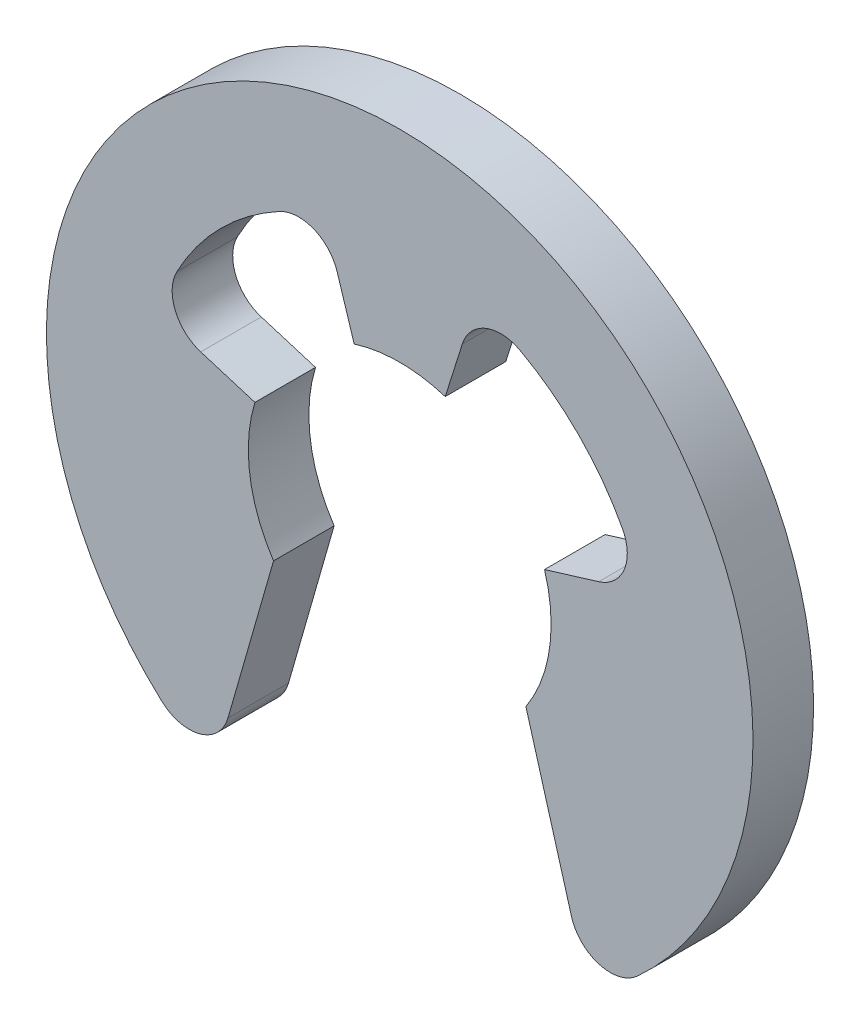
ISO-10303-21;
HEADER;
FILE_DESCRIPTION(('STEP AP214'),'2;1');
FILE_NAME('part.step','',(''),(''),'','','');
FILE_SCHEMA(('AUTOMOTIVE_DESIGN { 1 0 10303 214 1 1 1 1 }'));
ENDSEC;
DATA;
#1=APPLICATION_CONTEXT('core data for automotive mechanical design processes');
#2=APPLICATION_PROTOCOL_DEFINITION('international standard','automotive_design',2000,#1);
#3=PRODUCT_CONTEXT('',#1,'mechanical');
#4=PRODUCT('Part','Part','',(#3));
#5=PRODUCT_RELATED_PRODUCT_CATEGORY('part','',(#4));
#6=PRODUCT_DEFINITION_FORMATION('','',#4);
#7=PRODUCT_DEFINITION_CONTEXT('part definition',#1,'design');
#8=PRODUCT_DEFINITION('design','',#6,#7);
#9=PRODUCT_DEFINITION_SHAPE('','',#8);
#10=(LENGTH_UNIT() NAMED_UNIT(*) SI_UNIT(.MILLI.,.METRE.));
#11=(NAMED_UNIT(*) PLANE_ANGLE_UNIT() SI_UNIT($,.RADIAN.));
#12=(NAMED_UNIT(*) SI_UNIT($,.STERADIAN.) SOLID_ANGLE_UNIT());
#13=UNCERTAINTY_MEASURE_WITH_UNIT(LENGTH_MEASURE(1.E-05),#10,'distance_accuracy_value','');
#14=(GEOMETRIC_REPRESENTATION_CONTEXT(3) GLOBAL_UNCERTAINTY_ASSIGNED_CONTEXT((#13)) GLOBAL_UNIT_ASSIGNED_CONTEXT((#10,
#11,#12)) REPRESENTATION_CONTEXT('',''));
#15=CARTESIAN_POINT('',(0.,0.,0.));
#16=DIRECTION('',(0.,0.,1.));
#17=DIRECTION('',(1.,0.,0.));
#18=AXIS2_PLACEMENT_3D('',#15,#16,#17);
#19=CARTESIAN_POINT('',(0.,0.,0.6));
#20=DIRECTION('',(0.,0.,1.));
#21=DIRECTION('',(1.,0.,0.));
#22=AXIS2_PLACEMENT_3D('',#19,#20,#21);
#23=PLANE('',#22);
#24=DIRECTION('',(0.300705799504274,-0.953716950748227,0.));
#25=VECTOR('',#24,1.);
#26=CARTESIAN_POINT('',(-0.619920886795964,1.96613786243847,0.6));
#27=LINE('',#26,#25);
#28=CARTESIAN_POINT('',(-0.619920886795964,1.96613786243847,0.6));
#29=VERTEX_POINT('',#28);
#30=CARTESIAN_POINT('',(-0.451058699256411,1.43057542612234,0.6));
#31=VERTEX_POINT('',#30);
#32=EDGE_CURVE('E170',#29,#31,#27,.T.);
#33=ORIENTED_EDGE('',*,*,#32,.T.);
#34=CARTESIAN_POINT('',(0.,0.,0.6));
#35=DIRECTION('',(0.,0.,-1.));
#36=DIRECTION('',(-1.,0.,0.));
#37=AXIS2_PLACEMENT_3D('',#34,#35,#36);
#38=CIRCLE('',#37,1.5);
#39=CARTESIAN_POINT('',(0.451058699256411,1.43057542612234,0.6));
#40=VERTEX_POINT('',#39);
#41=EDGE_CURVE('E141',#31,#40,#38,.T.);
#42=ORIENTED_EDGE('',*,*,#41,.T.);
#43=DIRECTION('',(0.300705799504274,0.953716950748227,0.));
#44=VECTOR('',#43,1.);
#45=CARTESIAN_POINT('',(0.451058699256411,1.43057542612234,0.6));
#46=LINE('',#45,#44);
#47=CARTESIAN_POINT('',(0.619920886795964,1.96613786243847,0.6));
#48=VERTEX_POINT('',#47);
#49=EDGE_CURVE('E138',#40,#48,#46,.T.);
#50=ORIENTED_EDGE('',*,*,#49,.T.);
#51=CARTESIAN_POINT('',(1.00140766709525,1.84585554263676,0.6));
#52=DIRECTION('',(0.,0.,-1.));
#53=DIRECTION('',(-1.,0.,0.));
#54=AXIS2_PLACEMENT_3D('',#51,#52,#53);
#55=CIRCLE('',#54,0.4);
#56=CARTESIAN_POINT('',(1.19215198463721,2.19744707456757,0.6));
#57=VERTEX_POINT('',#56);
#58=EDGE_CURVE('E19',#48,#57,#55,.T.);
#59=ORIENTED_EDGE('',*,*,#58,.T.);
#60=CARTESIAN_POINT('',(0.,0.,0.6));
#61=DIRECTION('',(0.,0.,-1.));
#62=DIRECTION('',(-1.,0.,0.));
#63=AXIS2_PLACEMENT_3D('',#60,#61,#62);
#64=CIRCLE('',#63,2.5);
#65=CARTESIAN_POINT('',(2.20776675912972,1.17293049124058,0.6));
#66=VERTEX_POINT('',#65);
#67=EDGE_CURVE('E172',#57,#66,#64,.T.);
#68=ORIENTED_EDGE('',*,*,#67,.T.);
#69=CARTESIAN_POINT('',(1.85452407766896,0.985261612642088,0.6));
#70=DIRECTION('',(0.,0.,-1.));
#71=DIRECTION('',(-1.,0.,0.));
#72=AXIS2_PLACEMENT_3D('',#69,#70,#71);
#73=CIRCLE('',#72,0.4);
#74=CARTESIAN_POINT('',(1.97147275955806,0.602739710256873,0.6));
#75=VERTEX_POINT('',#74);
#76=EDGE_CURVE('E175',#66,#75,#73,.T.);
#77=ORIENTED_EDGE('',*,*,#76,.T.);
#78=DIRECTION('',(-0.956304755963035,-0.292371704722738,0.));
#79=VECTOR('',#78,1.);
#80=CARTESIAN_POINT('',(0.,0.,0.6));
#81=LINE('',#80,#79);
#82=CARTESIAN_POINT('',(1.43445713394455,0.438557557084107,0.6));
#83=VERTEX_POINT('',#82);
#84=EDGE_CURVE('E178',#83,#75,#81,.F.);
#85=ORIENTED_EDGE('',*,*,#84,.F.);
#86=CARTESIAN_POINT('',(0.,0.,0.6));
#87=DIRECTION('',(0.,0.,-1.));
#88=DIRECTION('',(-1.,0.,0.));
#89=AXIS2_PLACEMENT_3D('',#86,#87,#88);
#90=CIRCLE('',#89,1.5);
#91=CARTESIAN_POINT('',(1.25,-0.82915619758885,0.6));
#92=VERTEX_POINT('',#91);
#93=EDGE_CURVE('E179',#83,#92,#90,.T.);
#94=ORIENTED_EDGE('',*,*,#93,.T.);
#95=DIRECTION('',(-0.275637355816993,0.961261695938321,0.));
#96=VECTOR('',#95,1.);
#97=CARTESIAN_POINT('',(0.935337139017433,0.268203608742087,0.6));
#98=LINE('',#97,#96);
#99=CARTESIAN_POINT('',(1.701429837776,-2.40347913422966,0.6));
#100=VERTEX_POINT('',#99);
#101=EDGE_CURVE('E186',#92,#100,#98,.F.);
#102=ORIENTED_EDGE('',*,*,#101,.T.);
#103=CARTESIAN_POINT('',(2.08593451615133,-2.29322419190286,0.6));
#104=DIRECTION('',(0.,0.,-1.));
#105=DIRECTION('',(-1.,0.,0.));
#106=AXIS2_PLACEMENT_3D('',#103,#104,#105);
#107=CIRCLE('',#106,0.4);
#108=CARTESIAN_POINT('',(2.35508735694505,-2.58912408763226,0.6));
#109=VERTEX_POINT('',#108);
#110=EDGE_CURVE('E183',#109,#100,#107,.T.);
#111=ORIENTED_EDGE('',*,*,#110,.F.);
#112=CARTESIAN_POINT('',(0.,0.,0.6));
#113=DIRECTION('',(0.,0.,-1.));
#114=DIRECTION('',(-1.,0.,0.));
#115=AXIS2_PLACEMENT_3D('',#112,#113,#114);
#116=CIRCLE('',#115,3.5);
#117=CARTESIAN_POINT('',(-2.35508735694505,-2.58912408763226,0.6));
#118=VERTEX_POINT('',#117);
#119=EDGE_CURVE('E187',#118,#109,#116,.T.);
#120=ORIENTED_EDGE('',*,*,#119,.F.);
#121=CARTESIAN_POINT('',(-2.08593451615133,-2.29322419190286,0.6));
#122=DIRECTION('',(0.,0.,-1.));
#123=DIRECTION('',(-1.,0.,0.));
#124=AXIS2_PLACEMENT_3D('',#121,#122,#123);
#125=CIRCLE('',#124,0.4);
#126=CARTESIAN_POINT('',(-1.701429837776,-2.40347913422966,0.6));
#127=VERTEX_POINT('',#126);
#128=EDGE_CURVE('E154',#118,#127,#125,.F.);
#129=ORIENTED_EDGE('',*,*,#128,.T.);
#130=DIRECTION('',(0.275637355816993,0.961261695938321,0.));
#131=VECTOR('',#130,1.);
#132=CARTESIAN_POINT('',(-1.701429837776,-2.40347913422966,0.6));
#133=LINE('',#132,#131);
#134=CARTESIAN_POINT('',(-1.25,-0.82915619758885,0.6));
#135=VERTEX_POINT('',#134);
#136=EDGE_CURVE('E155',#127,#135,#133,.T.);
#137=ORIENTED_EDGE('',*,*,#136,.T.);
#138=CARTESIAN_POINT('',(0.,0.,0.6));
#139=DIRECTION('',(0.,0.,-1.));
#140=DIRECTION('',(-1.,0.,0.));
#141=AXIS2_PLACEMENT_3D('',#138,#139,#140);
#142=CIRCLE('',#141,1.5);
#143=CARTESIAN_POINT('',(-1.43445713394456,0.438557557084096,0.6));
#144=VERTEX_POINT('',#143);
#145=EDGE_CURVE('E159',#135,#144,#142,.T.);
#146=ORIENTED_EDGE('',*,*,#145,.T.);
#147=DIRECTION('',(-0.956304755963037,0.29237170472273,0.));
#148=VECTOR('',#147,1.);
#149=CARTESIAN_POINT('',(-1.43445713394456,0.438557557084096,0.6));
#150=LINE('',#149,#148);
#151=CARTESIAN_POINT('',(-1.97147275955806,0.602739710256858,0.6));
#152=VERTEX_POINT('',#151);
#153=EDGE_CURVE('E163',#144,#152,#150,.T.);
#154=ORIENTED_EDGE('',*,*,#153,.T.);
#155=CARTESIAN_POINT('',(-1.85452407766897,0.985261612642073,0.6));
#156=DIRECTION('',(0.,0.,-1.));
#157=DIRECTION('',(-1.,0.,0.));
#158=AXIS2_PLACEMENT_3D('',#155,#156,#157);
#159=CIRCLE('',#158,0.4);
#160=CARTESIAN_POINT('',(-2.20776675912973,1.17293049124056,0.6));
#161=VERTEX_POINT('',#160);
#162=EDGE_CURVE('E164',#152,#161,#159,.T.);
#163=ORIENTED_EDGE('',*,*,#162,.T.);
#164=CARTESIAN_POINT('',(0.,0.,0.6));
#165=DIRECTION('',(0.,0.,-1.));
#166=DIRECTION('',(-1.,0.,0.));
#167=AXIS2_PLACEMENT_3D('',#164,#165,#166);
#168=CIRCLE('',#167,2.5);
#169=CARTESIAN_POINT('',(-1.19215198463721,2.19744707456757,0.6));
#170=VERTEX_POINT('',#169);
#171=EDGE_CURVE('E166',#161,#170,#168,.T.);
#172=ORIENTED_EDGE('',*,*,#171,.T.);
#173=CARTESIAN_POINT('',(-1.00140766709525,1.84585554263676,0.6));
#174=DIRECTION('',(0.,0.,-1.));
#175=DIRECTION('',(-1.,0.,0.));
#176=AXIS2_PLACEMENT_3D('',#173,#174,#175);
#177=CIRCLE('',#176,0.4);
#178=EDGE_CURVE('E168',#170,#29,#177,.T.);
#179=ORIENTED_EDGE('',*,*,#178,.T.);
#180=EDGE_LOOP('',(#33,#42,#50,#59,#68,#77,#85,#94,#102,#111,#120,#129,#137,#146,#154,#163,#172,#179));
#181=FACE_BOUND('',#180,.T.);
#182=ADVANCED_FACE('F16',(#181),#23,.T.);
#183=CARTESIAN_POINT('',(0.,0.,0.6));
#184=DIRECTION('',(0.,0.,-1.));
#185=DIRECTION('',(-1.,0.,0.));
#186=AXIS2_PLACEMENT_3D('',#183,#184,#185);
#187=CYLINDRICAL_SURFACE('',#186,2.5);
#188=ORIENTED_EDGE('',*,*,#67,.F.);
#189=DIRECTION('',(0.,0.,-1.));
#190=VECTOR('',#189,1.);
#191=CARTESIAN_POINT('',(1.19215198463721,2.19744707456757,0.6));
#192=LINE('',#191,#190);
#193=CARTESIAN_POINT('',(1.19215198463721,2.19744707456757,0.));
#194=VERTEX_POINT('',#193);
#195=EDGE_CURVE('E148',#57,#194,#192,.T.);
#196=ORIENTED_EDGE('',*,*,#195,.T.);
#197=CARTESIAN_POINT('',(0.,0.,0.));
#198=DIRECTION('',(0.,0.,-1.));
#199=DIRECTION('',(-1.,0.,0.));
#200=AXIS2_PLACEMENT_3D('',#197,#198,#199);
#201=CIRCLE('',#200,2.5);
#202=CARTESIAN_POINT('',(2.20776675912972,1.17293049124058,0.));
#203=VERTEX_POINT('',#202);
#204=EDGE_CURVE('E191',#194,#203,#201,.T.);
#205=ORIENTED_EDGE('',*,*,#204,.T.);
#206=DIRECTION('',(0.,0.,-1.));
#207=VECTOR('',#206,1.);
#208=CARTESIAN_POINT('',(2.20776675912972,1.17293049124058,0.6));
#209=LINE('',#208,#207);
#210=EDGE_CURVE('E174',#203,#66,#209,.F.);
#211=ORIENTED_EDGE('',*,*,#210,.T.);
#212=EDGE_LOOP('',(#188,#196,#205,#211));
#213=FACE_BOUND('',#212,.T.);
#214=ADVANCED_FACE('F338',(#213),#187,.F.);
#215=CARTESIAN_POINT('',(1.85452407766896,0.985261612642088,0.6));
#216=DIRECTION('',(0.,0.,-1.));
#217=DIRECTION('',(-1.,0.,0.));
#218=AXIS2_PLACEMENT_3D('',#215,#216,#217);
#219=CYLINDRICAL_SURFACE('',#218,0.4);
#220=ORIENTED_EDGE('',*,*,#76,.F.);
#221=ORIENTED_EDGE('',*,*,#210,.F.);
#222=CARTESIAN_POINT('',(1.85452407766896,0.985261612642088,0.));
#223=DIRECTION('',(0.,0.,-1.));
#224=DIRECTION('',(-1.,0.,0.));
#225=AXIS2_PLACEMENT_3D('',#222,#223,#224);
#226=CIRCLE('',#225,0.4);
#227=CARTESIAN_POINT('',(1.97147275955806,0.602739710256873,0.));
#228=VERTEX_POINT('',#227);
#229=EDGE_CURVE('E194',#203,#228,#226,.T.);
#230=ORIENTED_EDGE('',*,*,#229,.T.);
#231=DIRECTION('',(0.,0.,1.));
#232=VECTOR('',#231,1.);
#233=CARTESIAN_POINT('',(1.97147275955806,0.602739710256873,0.6));
#234=LINE('',#233,#232);
#235=EDGE_CURVE('E227',#75,#228,#234,.F.);
#236=ORIENTED_EDGE('',*,*,#235,.F.);
#237=EDGE_LOOP('',(#220,#221,#230,#236));
#238=FACE_BOUND('',#237,.T.);
#239=ADVANCED_FACE('F336',(#238),#219,.F.);
#240=CARTESIAN_POINT('',(0.,0.,0.6));
#241=DIRECTION('',(-0.292371704722738,0.956304755963035,0.));
#242=DIRECTION('',(-0.956304755963035,-0.292371704722738,0.));
#243=AXIS2_PLACEMENT_3D('',#240,#241,#242);
#244=PLANE('',#243);
#245=DIRECTION('',(-0.956304755963035,-0.292371704722737,0.));
#246=VECTOR('',#245,1.);
#247=CARTESIAN_POINT('',(1.97147275955806,0.602739710256873,0.));
#248=LINE('',#247,#246);
#249=CARTESIAN_POINT('',(1.43445713394455,0.438557557084107,0.));
#250=VERTEX_POINT('',#249);
#251=EDGE_CURVE('E197',#228,#250,#248,.T.);
#252=ORIENTED_EDGE('',*,*,#251,.T.);
#253=DIRECTION('',(0.,0.,-1.));
#254=VECTOR('',#253,1.);
#255=CARTESIAN_POINT('',(1.43445713394455,0.438557557084107,0.6));
#256=LINE('',#255,#254);
#257=EDGE_CURVE('E182',#250,#83,#256,.F.);
#258=ORIENTED_EDGE('',*,*,#257,.T.);
#259=ORIENTED_EDGE('',*,*,#84,.T.);
#260=ORIENTED_EDGE('',*,*,#235,.T.);
#261=EDGE_LOOP('',(#252,#258,#259,#260));
#262=FACE_BOUND('',#261,.T.);
#263=ADVANCED_FACE('F331',(#262),#244,.T.);
#264=CARTESIAN_POINT('',(0.,0.,0.6));
#265=DIRECTION('',(0.,0.,-1.));
#266=DIRECTION('',(-1.,0.,0.));
#267=AXIS2_PLACEMENT_3D('',#264,#265,#266);
#268=CYLINDRICAL_SURFACE('',#267,1.5);
#269=ORIENTED_EDGE('',*,*,#93,.F.);
#270=ORIENTED_EDGE('',*,*,#257,.F.);
#271=CARTESIAN_POINT('',(0.,0.,0.));
#272=DIRECTION('',(0.,0.,-1.));
#273=DIRECTION('',(-1.,0.,0.));
#274=AXIS2_PLACEMENT_3D('',#271,#272,#273);
#275=CIRCLE('',#274,1.5);
#276=CARTESIAN_POINT('',(1.25,-0.82915619758885,0.));
#277=VERTEX_POINT('',#276);
#278=EDGE_CURVE('E198',#250,#277,#275,.T.);
#279=ORIENTED_EDGE('',*,*,#278,.T.);
#280=DIRECTION('',(0.,0.,1.));
#281=VECTOR('',#280,1.);
#282=CARTESIAN_POINT('',(1.25,-0.82915619758885,0.6));
#283=LINE('',#282,#281);
#284=EDGE_CURVE('E181',#277,#92,#283,.T.);
#285=ORIENTED_EDGE('',*,*,#284,.T.);
#286=EDGE_LOOP('',(#269,#270,#279,#285));
#287=FACE_BOUND('',#286,.T.);
#288=ADVANCED_FACE('F329',(#287),#268,.F.);
#289=CARTESIAN_POINT('',(0.935337139017433,0.268203608742087,0.6));
#290=DIRECTION('',(0.961261695938321,0.275637355816993,0.));
#291=DIRECTION('',(-0.275637355816993,0.961261695938321,0.));
#292=AXIS2_PLACEMENT_3D('',#289,#290,#291);
#293=PLANE('',#292);
#294=ORIENTED_EDGE('',*,*,#101,.F.);
#295=ORIENTED_EDGE('',*,*,#284,.F.);
#296=DIRECTION('',(0.275637355816993,-0.961261695938321,0.));
#297=VECTOR('',#296,1.);
#298=CARTESIAN_POINT('',(1.25,-0.82915619758885,0.));
#299=LINE('',#298,#297);
#300=CARTESIAN_POINT('',(1.701429837776,-2.40347913422966,0.));
#301=VERTEX_POINT('',#300);
#302=EDGE_CURVE('E201',#277,#301,#299,.T.);
#303=ORIENTED_EDGE('',*,*,#302,.T.);
#304=DIRECTION('',(0.,0.,-1.));
#305=VECTOR('',#304,1.);
#306=CARTESIAN_POINT('',(1.701429837776,-2.40347913422966,0.6));
#307=LINE('',#306,#305);
#308=EDGE_CURVE('E185',#100,#301,#307,.T.);
#309=ORIENTED_EDGE('',*,*,#308,.F.);
#310=EDGE_LOOP('',(#294,#295,#303,#309));
#311=FACE_BOUND('',#310,.T.);
#312=ADVANCED_FACE('F324',(#311),#293,.F.);
#313=CARTESIAN_POINT('',(2.08593451615133,-2.29322419190286,0.6));
#314=DIRECTION('',(0.,0.,-1.));
#315=DIRECTION('',(-1.,0.,0.));
#316=AXIS2_PLACEMENT_3D('',#313,#314,#315);
#317=CYLINDRICAL_SURFACE('',#316,0.4);
#318=CARTESIAN_POINT('',(2.08593451615133,-2.29322419190286,0.));
#319=DIRECTION('',(0.,0.,-1.));
#320=DIRECTION('',(-1.,0.,0.));
#321=AXIS2_PLACEMENT_3D('',#318,#319,#320);
#322=CIRCLE('',#321,0.4);
#323=CARTESIAN_POINT('',(2.35508735694505,-2.58912408763226,0.));
#324=VERTEX_POINT('',#323);
#325=EDGE_CURVE('E202',#301,#324,#322,.F.);
#326=ORIENTED_EDGE('',*,*,#325,.T.);
#327=DIRECTION('',(0.,0.,-1.));
#328=VECTOR('',#327,1.);
#329=CARTESIAN_POINT('',(2.35508735694505,-2.58912408763226,0.6));
#330=LINE('',#329,#328);
#331=EDGE_CURVE('E190',#109,#324,#330,.T.);
#332=ORIENTED_EDGE('',*,*,#331,.F.);
#333=ORIENTED_EDGE('',*,*,#110,.T.);
#334=ORIENTED_EDGE('',*,*,#308,.T.);
#335=EDGE_LOOP('',(#326,#332,#333,#334));
#336=FACE_BOUND('',#335,.T.);
#337=ADVANCED_FACE('F319',(#336),#317,.T.);
#338=CARTESIAN_POINT('',(0.,0.,0.6));
#339=DIRECTION('',(0.,0.,-1.));
#340=DIRECTION('',(-1.,0.,0.));
#341=AXIS2_PLACEMENT_3D('',#338,#339,#340);
#342=CYLINDRICAL_SURFACE('',#341,3.5);
#343=CARTESIAN_POINT('',(0.,0.,0.));
#344=DIRECTION('',(0.,0.,-1.));
#345=DIRECTION('',(-1.,0.,0.));
#346=AXIS2_PLACEMENT_3D('',#343,#344,#345);
#347=CIRCLE('',#346,3.5);
#348=CARTESIAN_POINT('',(-2.35508735694505,-2.58912408763226,0.));
#349=VERTEX_POINT('',#348);
#350=EDGE_CURVE('E205',#324,#349,#347,.F.);
#351=ORIENTED_EDGE('',*,*,#350,.T.);
#352=DIRECTION('',(0.,0.,-1.));
#353=VECTOR('',#352,1.);
#354=CARTESIAN_POINT('',(-2.35508735694505,-2.58912408763226,0.6));
#355=LINE('',#354,#353);
#356=EDGE_CURVE('E189',#118,#349,#355,.T.);
#357=ORIENTED_EDGE('',*,*,#356,.F.);
#358=ORIENTED_EDGE('',*,*,#119,.T.);
#359=ORIENTED_EDGE('',*,*,#331,.T.);
#360=EDGE_LOOP('',(#351,#357,#358,#359));
#361=FACE_BOUND('',#360,.T.);
#362=ADVANCED_FACE('F435',(#361),#342,.T.);
#363=CARTESIAN_POINT('',(-2.08593451615133,-2.29322419190286,0.6));
#364=DIRECTION('',(0.,0.,-1.));
#365=DIRECTION('',(-1.,0.,0.));
#366=AXIS2_PLACEMENT_3D('',#363,#364,#365);
#367=CYLINDRICAL_SURFACE('',#366,0.4);
#368=CARTESIAN_POINT('',(-2.08593451615133,-2.29322419190286,0.));
#369=DIRECTION('',(0.,0.,-1.));
#370=DIRECTION('',(-1.,0.,0.));
#371=AXIS2_PLACEMENT_3D('',#368,#369,#370);
#372=CIRCLE('',#371,0.4);
#373=CARTESIAN_POINT('',(-1.701429837776,-2.40347913422966,0.));
#374=VERTEX_POINT('',#373);
#375=EDGE_CURVE('E207',#349,#374,#372,.F.);
#376=ORIENTED_EDGE('',*,*,#375,.T.);
#377=DIRECTION('',(0.,0.,1.));
#378=VECTOR('',#377,1.);
#379=CARTESIAN_POINT('',(-1.701429837776,-2.40347913422966,0.6));
#380=LINE('',#379,#378);
#381=EDGE_CURVE('E244',#127,#374,#380,.F.);
#382=ORIENTED_EDGE('',*,*,#381,.F.);
#383=ORIENTED_EDGE('',*,*,#128,.F.);
#384=ORIENTED_EDGE('',*,*,#356,.T.);
#385=EDGE_LOOP('',(#376,#382,#383,#384));
#386=FACE_BOUND('',#385,.T.);
#387=ADVANCED_FACE('F311',(#386),#367,.T.);
#388=CARTESIAN_POINT('',(-0.935337139017433,0.268203608742087,0.6));
#389=DIRECTION('',(0.961261695938321,-0.275637355816993,0.));
#390=DIRECTION('',(0.275637355816993,0.961261695938321,0.));
#391=AXIS2_PLACEMENT_3D('',#388,#389,#390);
#392=PLANE('',#391);
#393=DIRECTION('',(0.275637355816993,0.961261695938321,0.));
#394=VECTOR('',#393,1.);
#395=CARTESIAN_POINT('',(-1.701429837776,-2.40347913422966,0.));
#396=LINE('',#395,#394);
#397=CARTESIAN_POINT('',(-1.25,-0.82915619758885,0.));
#398=VERTEX_POINT('',#397);
#399=EDGE_CURVE('E210',#374,#398,#396,.T.);
#400=ORIENTED_EDGE('',*,*,#399,.T.);
#401=DIRECTION('',(0.,0.,-1.));
#402=VECTOR('',#401,1.);
#403=CARTESIAN_POINT('',(-1.25,-0.82915619758885,0.6));
#404=LINE('',#403,#402);
#405=EDGE_CURVE('E246',#398,#135,#404,.F.);
#406=ORIENTED_EDGE('',*,*,#405,.T.);
#407=ORIENTED_EDGE('',*,*,#136,.F.);
#408=ORIENTED_EDGE('',*,*,#381,.T.);
#409=EDGE_LOOP('',(#400,#406,#407,#408));
#410=FACE_BOUND('',#409,.T.);
#411=ADVANCED_FACE('F308',(#410),#392,.T.);
#412=CARTESIAN_POINT('',(0.,0.,0.6));
#413=DIRECTION('',(0.,0.,-1.));
#414=DIRECTION('',(-1.,0.,0.));
#415=AXIS2_PLACEMENT_3D('',#412,#413,#414);
#416=CYLINDRICAL_SURFACE('',#415,1.5);
#417=ORIENTED_EDGE('',*,*,#145,.F.);
#418=ORIENTED_EDGE('',*,*,#405,.F.);
#419=CARTESIAN_POINT('',(0.,0.,0.));
#420=DIRECTION('',(0.,0.,-1.));
#421=DIRECTION('',(-1.,0.,0.));
#422=AXIS2_PLACEMENT_3D('',#419,#420,#421);
#423=CIRCLE('',#422,1.5);
#424=CARTESIAN_POINT('',(-1.43445713394456,0.438557557084096,0.));
#425=VERTEX_POINT('',#424);
#426=EDGE_CURVE('E211',#398,#425,#423,.T.);
#427=ORIENTED_EDGE('',*,*,#426,.T.);
#428=DIRECTION('',(0.,0.,1.));
#429=VECTOR('',#428,1.);
#430=CARTESIAN_POINT('',(-1.43445713394456,0.438557557084096,0.6));
#431=LINE('',#430,#429);
#432=EDGE_CURVE('E249',#425,#144,#431,.T.);
#433=ORIENTED_EDGE('',*,*,#432,.T.);
#434=EDGE_LOOP('',(#417,#418,#427,#433));
#435=FACE_BOUND('',#434,.T.);
#436=ADVANCED_FACE('F304',(#435),#416,.F.);
#437=CARTESIAN_POINT('',(0.,0.,0.6));
#438=DIRECTION('',(-0.292371704722731,-0.956304755963037,0.));
#439=DIRECTION('',(0.956304755963037,-0.292371704722731,0.));
#440=AXIS2_PLACEMENT_3D('',#437,#438,#439);
#441=PLANE('',#440);
#442=ORIENTED_EDGE('',*,*,#153,.F.);
#443=ORIENTED_EDGE('',*,*,#432,.F.);
#444=DIRECTION('',(-0.956304755963037,0.29237170472273,0.));
#445=VECTOR('',#444,1.);
#446=CARTESIAN_POINT('',(-1.43445713394456,0.438557557084096,0.));
#447=LINE('',#446,#445);
#448=CARTESIAN_POINT('',(-1.97147275955806,0.602739710256858,0.));
#449=VERTEX_POINT('',#448);
#450=EDGE_CURVE('E213',#425,#449,#447,.T.);
#451=ORIENTED_EDGE('',*,*,#450,.T.);
#452=DIRECTION('',(0.,0.,-1.));
#453=VECTOR('',#452,1.);
#454=CARTESIAN_POINT('',(-1.97147275955806,0.602739710256858,0.6));
#455=LINE('',#454,#453);
#456=EDGE_CURVE('E252',#449,#152,#455,.F.);
#457=ORIENTED_EDGE('',*,*,#456,.T.);
#458=EDGE_LOOP('',(#442,#443,#451,#457));
#459=FACE_BOUND('',#458,.T.);
#460=ADVANCED_FACE('F302',(#459),#441,.F.);
#461=CARTESIAN_POINT('',(-1.85452407766897,0.985261612642073,0.6));
#462=DIRECTION('',(0.,0.,-1.));
#463=DIRECTION('',(-1.,0.,0.));
#464=AXIS2_PLACEMENT_3D('',#461,#462,#463);
#465=CYLINDRICAL_SURFACE('',#464,0.4);
#466=ORIENTED_EDGE('',*,*,#162,.F.);
#467=ORIENTED_EDGE('',*,*,#456,.F.);
#468=CARTESIAN_POINT('',(-1.85452407766897,0.985261612642073,0.));
#469=DIRECTION('',(0.,0.,-1.));
#470=DIRECTION('',(-1.,0.,0.));
#471=AXIS2_PLACEMENT_3D('',#468,#469,#470);
#472=CIRCLE('',#471,0.4);
#473=CARTESIAN_POINT('',(-2.20776675912973,1.17293049124056,0.));
#474=VERTEX_POINT('',#473);
#475=EDGE_CURVE('E214',#449,#474,#472,.T.);
#476=ORIENTED_EDGE('',*,*,#475,.T.);
#477=DIRECTION('',(0.,0.,-1.));
#478=VECTOR('',#477,1.);
#479=CARTESIAN_POINT('',(-2.20776675912973,1.17293049124056,0.6));
#480=LINE('',#479,#478);
#481=EDGE_CURVE('E255',#474,#161,#480,.F.);
#482=ORIENTED_EDGE('',*,*,#481,.T.);
#483=EDGE_LOOP('',(#466,#467,#476,#482));
#484=FACE_BOUND('',#483,.T.);
#485=ADVANCED_FACE('F394',(#484),#465,.F.);
#486=CARTESIAN_POINT('',(0.,0.,0.6));
#487=DIRECTION('',(0.,0.,-1.));
#488=DIRECTION('',(-1.,0.,0.));
#489=AXIS2_PLACEMENT_3D('',#486,#487,#488);
#490=CYLINDRICAL_SURFACE('',#489,2.5);
#491=ORIENTED_EDGE('',*,*,#171,.F.);
#492=ORIENTED_EDGE('',*,*,#481,.F.);
#493=CARTESIAN_POINT('',(0.,0.,0.));
#494=DIRECTION('',(0.,0.,-1.));
#495=DIRECTION('',(-1.,0.,0.));
#496=AXIS2_PLACEMENT_3D('',#493,#494,#495);
#497=CIRCLE('',#496,2.5);
#498=CARTESIAN_POINT('',(-1.19215198463721,2.19744707456757,0.));
#499=VERTEX_POINT('',#498);
#500=EDGE_CURVE('E216',#474,#499,#497,.T.);
#501=ORIENTED_EDGE('',*,*,#500,.T.);
#502=DIRECTION('',(0.,0.,-1.));
#503=VECTOR('',#502,1.);
#504=CARTESIAN_POINT('',(-1.19215198463721,2.19744707456757,0.6));
#505=LINE('',#504,#503);
#506=EDGE_CURVE('E258',#499,#170,#505,.F.);
#507=ORIENTED_EDGE('',*,*,#506,.T.);
#508=EDGE_LOOP('',(#491,#492,#501,#507));
#509=FACE_BOUND('',#508,.T.);
#510=ADVANCED_FACE('F293',(#509),#490,.F.);
#511=CARTESIAN_POINT('',(-1.00140766709525,1.84585554263676,0.6));
#512=DIRECTION('',(0.,0.,-1.));
#513=DIRECTION('',(-1.,0.,0.));
#514=AXIS2_PLACEMENT_3D('',#511,#512,#513);
#515=CYLINDRICAL_SURFACE('',#514,0.4);
#516=ORIENTED_EDGE('',*,*,#178,.F.);
#517=ORIENTED_EDGE('',*,*,#506,.F.);
#518=CARTESIAN_POINT('',(-1.00140766709525,1.84585554263676,0.));
#519=DIRECTION('',(0.,0.,-1.));
#520=DIRECTION('',(-1.,0.,0.));
#521=AXIS2_PLACEMENT_3D('',#518,#519,#520);
#522=CIRCLE('',#521,0.4);
#523=CARTESIAN_POINT('',(-0.619920886795964,1.96613786243847,0.));
#524=VERTEX_POINT('',#523);
#525=EDGE_CURVE('E219',#499,#524,#522,.T.);
#526=ORIENTED_EDGE('',*,*,#525,.T.);
#527=DIRECTION('',(0.,0.,1.));
#528=VECTOR('',#527,1.);
#529=CARTESIAN_POINT('',(-0.619920886795964,1.96613786243847,0.6));
#530=LINE('',#529,#528);
#531=EDGE_CURVE('E261',#29,#524,#530,.F.);
#532=ORIENTED_EDGE('',*,*,#531,.F.);
#533=EDGE_LOOP('',(#516,#517,#526,#532));
#534=FACE_BOUND('',#533,.T.);
#535=ADVANCED_FACE('F290',(#534),#515,.F.);
#536=CARTESIAN_POINT('',(0.,0.,0.6));
#537=DIRECTION('',(-0.953716950748227,-0.300705799504274,0.));
#538=DIRECTION('',(0.300705799504274,-0.953716950748227,0.));
#539=AXIS2_PLACEMENT_3D('',#536,#537,#538);
#540=PLANE('',#539);
#541=DIRECTION('',(0.300705799504274,-0.953716950748227,0.));
#542=VECTOR('',#541,1.);
#543=CARTESIAN_POINT('',(-0.619920886795964,1.96613786243847,0.));
#544=LINE('',#543,#542);
#545=CARTESIAN_POINT('',(-0.451058699256411,1.43057542612234,0.));
#546=VERTEX_POINT('',#545);
#547=EDGE_CURVE('E222',#524,#546,#544,.T.);
#548=ORIENTED_EDGE('',*,*,#547,.T.);
#549=DIRECTION('',(0.,0.,-1.));
#550=VECTOR('',#549,1.);
#551=CARTESIAN_POINT('',(-0.451058699256411,1.43057542612234,0.6));
#552=LINE('',#551,#550);
#553=EDGE_CURVE('E263',#546,#31,#552,.F.);
#554=ORIENTED_EDGE('',*,*,#553,.T.);
#555=ORIENTED_EDGE('',*,*,#32,.F.);
#556=ORIENTED_EDGE('',*,*,#531,.T.);
#557=EDGE_LOOP('',(#548,#554,#555,#556));
#558=FACE_BOUND('',#557,.T.);
#559=ADVANCED_FACE('F280',(#558),#540,.T.);
#560=CARTESIAN_POINT('',(0.,0.,0.6));
#561=DIRECTION('',(0.,0.,-1.));
#562=DIRECTION('',(-1.,0.,0.));
#563=AXIS2_PLACEMENT_3D('',#560,#561,#562);
#564=CYLINDRICAL_SURFACE('',#563,1.5);
#565=ORIENTED_EDGE('',*,*,#41,.F.);
#566=ORIENTED_EDGE('',*,*,#553,.F.);
#567=CARTESIAN_POINT('',(0.,0.,0.));
#568=DIRECTION('',(0.,0.,-1.));
#569=DIRECTION('',(-1.,0.,0.));
#570=AXIS2_PLACEMENT_3D('',#567,#568,#569);
#571=CIRCLE('',#570,1.5);
#572=CARTESIAN_POINT('',(0.451058699256411,1.43057542612234,0.));
#573=VERTEX_POINT('',#572);
#574=EDGE_CURVE('E223',#546,#573,#571,.T.);
#575=ORIENTED_EDGE('',*,*,#574,.T.);
#576=DIRECTION('',(0.,0.,1.));
#577=VECTOR('',#576,1.);
#578=CARTESIAN_POINT('',(0.451058699256411,1.43057542612234,0.6));
#579=LINE('',#578,#577);
#580=EDGE_CURVE('E149',#573,#40,#579,.T.);
#581=ORIENTED_EDGE('',*,*,#580,.T.);
#582=EDGE_LOOP('',(#565,#566,#575,#581));
#583=FACE_BOUND('',#582,.T.);
#584=ADVANCED_FACE('F340',(#583),#564,.F.);
#585=CARTESIAN_POINT('',(0.,0.,0.6));
#586=DIRECTION('',(-0.953716950748227,0.300705799504274,0.));
#587=DIRECTION('',(-0.300705799504274,-0.953716950748227,0.));
#588=AXIS2_PLACEMENT_3D('',#585,#586,#587);
#589=PLANE('',#588);
#590=ORIENTED_EDGE('',*,*,#49,.F.);
#591=ORIENTED_EDGE('',*,*,#580,.F.);
#592=DIRECTION('',(0.300705799504274,0.953716950748227,0.));
#593=VECTOR('',#592,1.);
#594=CARTESIAN_POINT('',(0.451058699256411,1.43057542612234,0.));
#595=LINE('',#594,#593);
#596=CARTESIAN_POINT('',(0.619920886795964,1.96613786243847,0.));
#597=VERTEX_POINT('',#596);
#598=EDGE_CURVE('E25',#573,#597,#595,.T.);
#599=ORIENTED_EDGE('',*,*,#598,.T.);
#600=DIRECTION('',(0.,0.,-1.));
#601=VECTOR('',#600,1.);
#602=CARTESIAN_POINT('',(0.619920886795964,1.96613786243847,0.6));
#603=LINE('',#602,#601);
#604=EDGE_CURVE('E33',#597,#48,#603,.F.);
#605=ORIENTED_EDGE('',*,*,#604,.T.);
#606=EDGE_LOOP('',(#590,#591,#599,#605));
#607=FACE_BOUND('',#606,.T.);
#608=ADVANCED_FACE('F146',(#607),#589,.F.);
#609=CARTESIAN_POINT('',(1.00140766709525,1.84585554263676,0.6));
#610=DIRECTION('',(0.,0.,-1.));
#611=DIRECTION('',(-1.,0.,0.));
#612=AXIS2_PLACEMENT_3D('',#609,#610,#611);
#613=CYLINDRICAL_SURFACE('',#612,0.4);
#614=ORIENTED_EDGE('',*,*,#58,.F.);
#615=ORIENTED_EDGE('',*,*,#604,.F.);
#616=CARTESIAN_POINT('',(1.00140766709525,1.84585554263676,0.));
#617=DIRECTION('',(0.,0.,-1.));
#618=DIRECTION('',(-1.,0.,0.));
#619=AXIS2_PLACEMENT_3D('',#616,#617,#618);
#620=CIRCLE('',#619,0.4);
#621=EDGE_CURVE('E11',#597,#194,#620,.T.);
#622=ORIENTED_EDGE('',*,*,#621,.T.);
#623=ORIENTED_EDGE('',*,*,#195,.F.);
#624=EDGE_LOOP('',(#614,#615,#622,#623));
#625=FACE_BOUND('',#624,.T.);
#626=ADVANCED_FACE('F152',(#625),#613,.F.);
#627=CARTESIAN_POINT('',(0.,0.,0.));
#628=DIRECTION('',(0.,0.,1.));
#629=DIRECTION('',(1.,0.,0.));
#630=AXIS2_PLACEMENT_3D('',#627,#628,#629);
#631=PLANE('',#630);
#632=ORIENTED_EDGE('',*,*,#598,.F.);
#633=ORIENTED_EDGE('',*,*,#574,.F.);
#634=ORIENTED_EDGE('',*,*,#547,.F.);
#635=ORIENTED_EDGE('',*,*,#525,.F.);
#636=ORIENTED_EDGE('',*,*,#500,.F.);
#637=ORIENTED_EDGE('',*,*,#475,.F.);
#638=ORIENTED_EDGE('',*,*,#450,.F.);
#639=ORIENTED_EDGE('',*,*,#426,.F.);
#640=ORIENTED_EDGE('',*,*,#399,.F.);
#641=ORIENTED_EDGE('',*,*,#375,.F.);
#642=ORIENTED_EDGE('',*,*,#350,.F.);
#643=ORIENTED_EDGE('',*,*,#325,.F.);
#644=ORIENTED_EDGE('',*,*,#302,.F.);
#645=ORIENTED_EDGE('',*,*,#278,.F.);
#646=ORIENTED_EDGE('',*,*,#251,.F.);
#647=ORIENTED_EDGE('',*,*,#229,.F.);
#648=ORIENTED_EDGE('',*,*,#204,.F.);
#649=ORIENTED_EDGE('',*,*,#621,.F.);
#650=EDGE_LOOP('',(#632,#633,#634,#635,#636,#637,#638,#639,#640,#641,#642,#643,#644,#645,#646,
#647,#648,#649));
#651=FACE_BOUND('',#650,.T.);
#652=ADVANCED_FACE('F286',(#651),#631,.F.);
#653=CLOSED_SHELL('',(#182,#214,#239,#263,#288,#312,#337,#362,#387,#411,#436,#460,#485,#510,
#535,#559,#584,#608,#626,#652));
#654=MANIFOLD_SOLID_BREP('B1',#653);
#655=ADVANCED_BREP_SHAPE_REPRESENTATION('',(#18,#654),#14);
#656=SHAPE_DEFINITION_REPRESENTATION(#9,#655);
ENDSEC;
END-ISO-10303-21;
